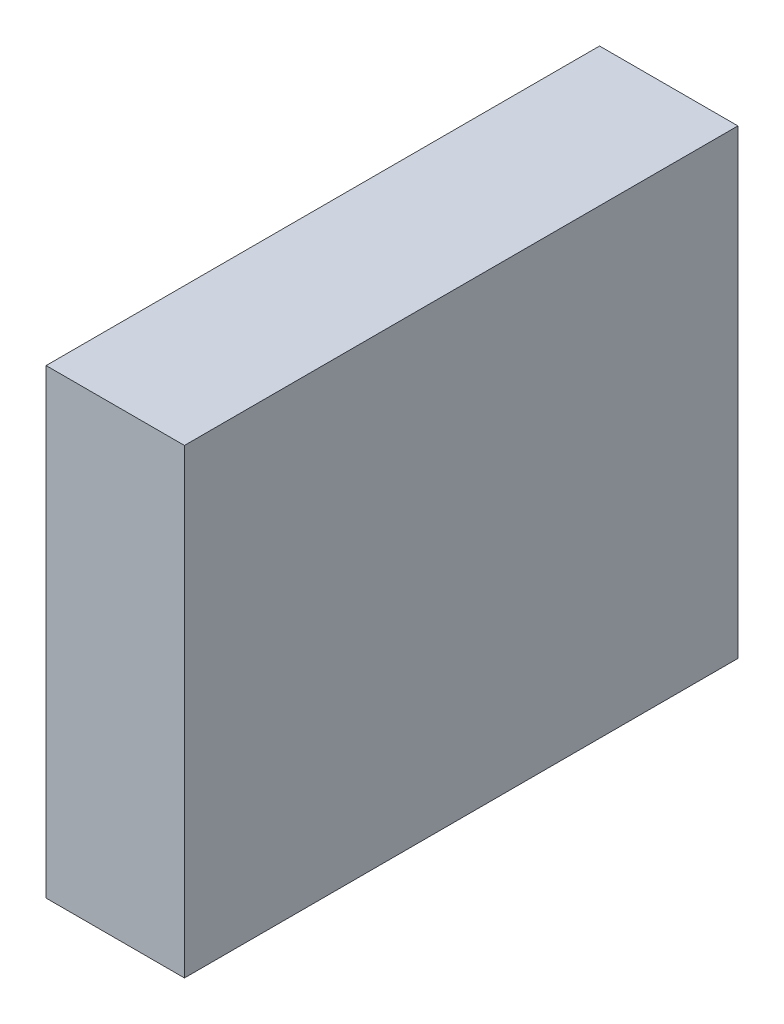
ISO-10303-21;
HEADER;
FILE_DESCRIPTION(('STEP AP214'),'2;1');
FILE_NAME('part.step','',(''),(''),'','','');
FILE_SCHEMA(('AUTOMOTIVE_DESIGN { 1 0 10303 214 1 1 1 1 }'));
ENDSEC;
DATA;
#1=APPLICATION_CONTEXT('core data for automotive mechanical design processes');
#2=APPLICATION_PROTOCOL_DEFINITION('international standard','automotive_design',2000,#1);
#3=PRODUCT_CONTEXT('',#1,'mechanical');
#4=PRODUCT('Part','Part','',(#3));
#5=PRODUCT_RELATED_PRODUCT_CATEGORY('part','',(#4));
#6=PRODUCT_DEFINITION_FORMATION('','',#4);
#7=PRODUCT_DEFINITION_CONTEXT('part definition',#1,'design');
#8=PRODUCT_DEFINITION('design','',#6,#7);
#9=PRODUCT_DEFINITION_SHAPE('','',#8);
#10=(LENGTH_UNIT() NAMED_UNIT(*) SI_UNIT(.MILLI.,.METRE.));
#11=(NAMED_UNIT(*) PLANE_ANGLE_UNIT() SI_UNIT($,.RADIAN.));
#12=(NAMED_UNIT(*) SI_UNIT($,.STERADIAN.) SOLID_ANGLE_UNIT());
#13=UNCERTAINTY_MEASURE_WITH_UNIT(LENGTH_MEASURE(1.E-05),#10,'distance_accuracy_value','');
#14=(GEOMETRIC_REPRESENTATION_CONTEXT(3) GLOBAL_UNCERTAINTY_ASSIGNED_CONTEXT((#13)) GLOBAL_UNIT_ASSIGNED_CONTEXT((#10,
#11,#12)) REPRESENTATION_CONTEXT('',''));
#15=CARTESIAN_POINT('',(0.,0.,0.));
#16=DIRECTION('',(0.,0.,1.));
#17=DIRECTION('',(1.,0.,0.));
#18=AXIS2_PLACEMENT_3D('',#15,#16,#17);
#19=CARTESIAN_POINT('',(-76.2000000000001,-254.,609.6));
#20=DIRECTION('',(1.,0.,0.));
#21=DIRECTION('',(0.,0.,-1.));
#22=AXIS2_PLACEMENT_3D('',#19,#20,#21);
#23=PLANE('',#22);
#24=DIRECTION('',(0.,-1.,0.));
#25=VECTOR('',#24,1.);
#26=CARTESIAN_POINT('',(-76.2000000000001,-254.,0.));
#27=LINE('',#26,#25);
#28=CARTESIAN_POINT('',(-76.2000000000001,254.,0.));
#29=VERTEX_POINT('',#28);
#30=CARTESIAN_POINT('',(-76.2000000000001,-254.,0.));
#31=VERTEX_POINT('',#30);
#32=EDGE_CURVE('E117',#29,#31,#27,.T.);
#33=ORIENTED_EDGE('',*,*,#32,.T.);
#34=DIRECTION('',(0.,0.,-1.));
#35=VECTOR('',#34,1.);
#36=CARTESIAN_POINT('',(-76.2000000000001,-254.,609.6));
#37=LINE('',#36,#35);
#38=CARTESIAN_POINT('',(-76.2000000000001,-254.,609.6));
#39=VERTEX_POINT('',#38);
#40=EDGE_CURVE('E11',#39,#31,#37,.T.);
#41=ORIENTED_EDGE('',*,*,#40,.F.);
#42=DIRECTION('',(0.,-1.,0.));
#43=VECTOR('',#42,1.);
#44=CARTESIAN_POINT('',(-76.2000000000001,-254.,609.6));
#45=LINE('',#44,#43);
#46=CARTESIAN_POINT('',(-76.2000000000001,254.,609.6));
#47=VERTEX_POINT('',#46);
#48=EDGE_CURVE('E101',#47,#39,#45,.T.);
#49=ORIENTED_EDGE('',*,*,#48,.F.);
#50=DIRECTION('',(0.,0.,-1.));
#51=VECTOR('',#50,1.);
#52=CARTESIAN_POINT('',(-76.2000000000001,254.,609.6));
#53=LINE('',#52,#51);
#54=EDGE_CURVE('E113',#47,#29,#53,.T.);
#55=ORIENTED_EDGE('',*,*,#54,.T.);
#56=EDGE_LOOP('',(#33,#41,#49,#55));
#57=FACE_BOUND('',#56,.T.);
#58=ADVANCED_FACE('F49',(#57),#23,.F.);
#59=CARTESIAN_POINT('',(76.1999999999999,-254.,609.6));
#60=DIRECTION('',(0.,1.,0.));
#61=DIRECTION('',(0.,0.,1.));
#62=AXIS2_PLACEMENT_3D('',#59,#60,#61);
#63=PLANE('',#62);
#64=DIRECTION('',(1.,0.,0.));
#65=VECTOR('',#64,1.);
#66=CARTESIAN_POINT('',(76.1999999999999,-254.,0.));
#67=LINE('',#66,#65);
#68=CARTESIAN_POINT('',(76.1999999999999,-254.,0.));
#69=VERTEX_POINT('',#68);
#70=EDGE_CURVE('E106',#31,#69,#67,.T.);
#71=ORIENTED_EDGE('',*,*,#70,.T.);
#72=DIRECTION('',(0.,0.,-1.));
#73=VECTOR('',#72,1.);
#74=CARTESIAN_POINT('',(76.1999999999999,-254.,609.6));
#75=LINE('',#74,#73);
#76=CARTESIAN_POINT('',(76.1999999999999,-254.,609.6));
#77=VERTEX_POINT('',#76);
#78=EDGE_CURVE('E58',#77,#69,#75,.T.);
#79=ORIENTED_EDGE('',*,*,#78,.F.);
#80=DIRECTION('',(1.,0.,0.));
#81=VECTOR('',#80,1.);
#82=CARTESIAN_POINT('',(76.1999999999999,-254.,609.6));
#83=LINE('',#82,#81);
#84=EDGE_CURVE('E96',#39,#77,#83,.T.);
#85=ORIENTED_EDGE('',*,*,#84,.F.);
#86=ORIENTED_EDGE('',*,*,#40,.T.);
#87=EDGE_LOOP('',(#71,#79,#85,#86));
#88=FACE_BOUND('',#87,.T.);
#89=ADVANCED_FACE('F105',(#88),#63,.F.);
#90=CARTESIAN_POINT('',(76.1999999999999,-254.,609.6));
#91=DIRECTION('',(-1.,0.,0.));
#92=DIRECTION('',(0.,0.,1.));
#93=AXIS2_PLACEMENT_3D('',#90,#91,#92);
#94=PLANE('',#93);
#95=DIRECTION('',(0.,1.,0.));
#96=VECTOR('',#95,1.);
#97=CARTESIAN_POINT('',(76.1999999999999,-254.,0.));
#98=LINE('',#97,#96);
#99=CARTESIAN_POINT('',(76.1999999999999,254.,0.));
#100=VERTEX_POINT('',#99);
#101=EDGE_CURVE('E83',#69,#100,#98,.T.);
#102=ORIENTED_EDGE('',*,*,#101,.T.);
#103=DIRECTION('',(0.,0.,-1.));
#104=VECTOR('',#103,1.);
#105=CARTESIAN_POINT('',(76.1999999999999,254.,609.6));
#106=LINE('',#105,#104);
#107=CARTESIAN_POINT('',(76.1999999999999,254.,609.6));
#108=VERTEX_POINT('',#107);
#109=EDGE_CURVE('E108',#108,#100,#106,.T.);
#110=ORIENTED_EDGE('',*,*,#109,.F.);
#111=DIRECTION('',(0.,1.,0.));
#112=VECTOR('',#111,1.);
#113=CARTESIAN_POINT('',(76.1999999999999,-254.,609.6));
#114=LINE('',#113,#112);
#115=EDGE_CURVE('E99',#77,#108,#114,.T.);
#116=ORIENTED_EDGE('',*,*,#115,.F.);
#117=ORIENTED_EDGE('',*,*,#78,.T.);
#118=EDGE_LOOP('',(#102,#110,#116,#117));
#119=FACE_BOUND('',#118,.T.);
#120=ADVANCED_FACE('F109',(#119),#94,.F.);
#121=CARTESIAN_POINT('',(76.1999999999999,254.,609.6));
#122=DIRECTION('',(0.,-1.,0.));
#123=DIRECTION('',(0.,0.,-1.));
#124=AXIS2_PLACEMENT_3D('',#121,#122,#123);
#125=PLANE('',#124);
#126=DIRECTION('',(-1.,0.,0.));
#127=VECTOR('',#126,1.);
#128=CARTESIAN_POINT('',(76.1999999999999,254.,0.));
#129=LINE('',#128,#127);
#130=EDGE_CURVE('E89',#100,#29,#129,.T.);
#131=ORIENTED_EDGE('',*,*,#130,.T.);
#132=ORIENTED_EDGE('',*,*,#54,.F.);
#133=DIRECTION('',(-1.,0.,0.));
#134=VECTOR('',#133,1.);
#135=CARTESIAN_POINT('',(76.1999999999999,254.,609.6));
#136=LINE('',#135,#134);
#137=EDGE_CURVE('E66',#108,#47,#136,.T.);
#138=ORIENTED_EDGE('',*,*,#137,.F.);
#139=ORIENTED_EDGE('',*,*,#109,.T.);
#140=EDGE_LOOP('',(#131,#132,#138,#139));
#141=FACE_BOUND('',#140,.T.);
#142=ADVANCED_FACE('F130',(#141),#125,.F.);
#143=CARTESIAN_POINT('',(0.,0.,609.6));
#144=DIRECTION('',(0.,0.,1.));
#145=DIRECTION('',(1.,0.,0.));
#146=AXIS2_PLACEMENT_3D('',#143,#144,#145);
#147=PLANE('',#146);
#148=ORIENTED_EDGE('',*,*,#48,.T.);
#149=ORIENTED_EDGE('',*,*,#84,.T.);
#150=ORIENTED_EDGE('',*,*,#115,.T.);
#151=ORIENTED_EDGE('',*,*,#137,.T.);
#152=EDGE_LOOP('',(#148,#149,#150,#151));
#153=FACE_BOUND('',#152,.T.);
#154=ADVANCED_FACE('F97',(#153),#147,.T.);
#155=CARTESIAN_POINT('',(0.,0.,0.));
#156=DIRECTION('',(0.,0.,1.));
#157=DIRECTION('',(1.,0.,0.));
#158=AXIS2_PLACEMENT_3D('',#155,#156,#157);
#159=PLANE('',#158);
#160=ORIENTED_EDGE('',*,*,#32,.F.);
#161=ORIENTED_EDGE('',*,*,#130,.F.);
#162=ORIENTED_EDGE('',*,*,#101,.F.);
#163=ORIENTED_EDGE('',*,*,#70,.F.);
#164=EDGE_LOOP('',(#160,#161,#162,#163));
#165=FACE_BOUND('',#164,.T.);
#166=ADVANCED_FACE('F133',(#165),#159,.F.);
#167=CLOSED_SHELL('',(#58,#89,#120,#142,#154,#166));
#168=MANIFOLD_SOLID_BREP('B2',#167);
#169=ADVANCED_BREP_SHAPE_REPRESENTATION('',(#18,#168),#14);
#170=SHAPE_DEFINITION_REPRESENTATION(#9,#169);
ENDSEC;
END-ISO-10303-21;
